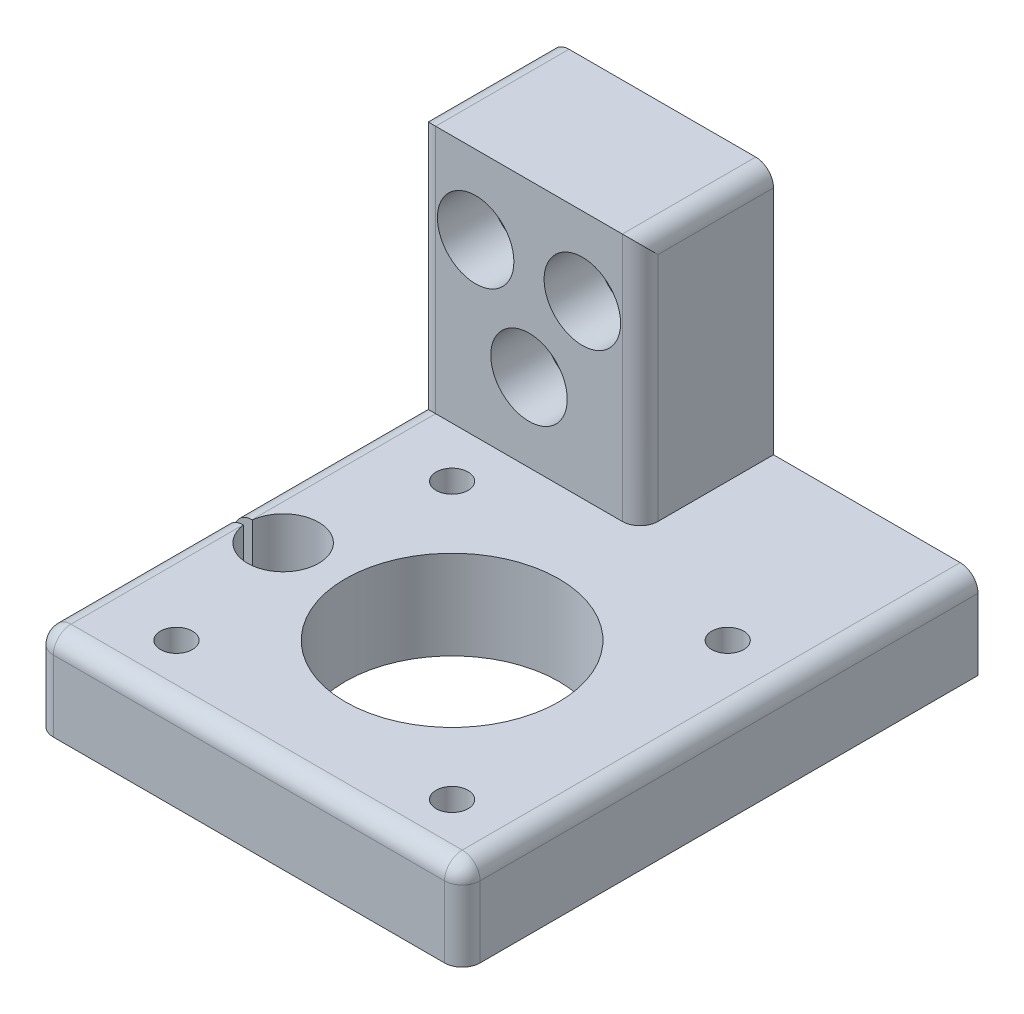
ISO-10303-21;
HEADER;
FILE_DESCRIPTION(('STEP AP214'),'2;1');
FILE_NAME('part.step','',(''),(''),'','','');
FILE_SCHEMA(('AUTOMOTIVE_DESIGN { 1 0 10303 214 1 1 1 1 }'));
ENDSEC;
DATA;
#1=APPLICATION_CONTEXT('core data for automotive mechanical design processes');
#2=APPLICATION_PROTOCOL_DEFINITION('international standard','automotive_design',2000,#1);
#3=PRODUCT_CONTEXT('',#1,'mechanical');
#4=PRODUCT('Part','Part','',(#3));
#5=PRODUCT_RELATED_PRODUCT_CATEGORY('part','',(#4));
#6=PRODUCT_DEFINITION_FORMATION('','',#4);
#7=PRODUCT_DEFINITION_CONTEXT('part definition',#1,'design');
#8=PRODUCT_DEFINITION('design','',#6,#7);
#9=PRODUCT_DEFINITION_SHAPE('','',#8);
#10=(LENGTH_UNIT() NAMED_UNIT(*) SI_UNIT(.MILLI.,.METRE.));
#11=(NAMED_UNIT(*) PLANE_ANGLE_UNIT() SI_UNIT($,.RADIAN.));
#12=(NAMED_UNIT(*) SI_UNIT($,.STERADIAN.) SOLID_ANGLE_UNIT());
#13=UNCERTAINTY_MEASURE_WITH_UNIT(LENGTH_MEASURE(1.E-05),#10,'distance_accuracy_value','');
#14=(GEOMETRIC_REPRESENTATION_CONTEXT(3) GLOBAL_UNCERTAINTY_ASSIGNED_CONTEXT((#13)) GLOBAL_UNIT_ASSIGNED_CONTEXT((#10,
#11,#12)) REPRESENTATION_CONTEXT('',''));
#15=CARTESIAN_POINT('',(0.,0.,0.));
#16=DIRECTION('',(0.,0.,1.));
#17=DIRECTION('',(1.,0.,0.));
#18=AXIS2_PLACEMENT_3D('',#15,#16,#17);
#19=CARTESIAN_POINT('',(12.5,18.8038475772934,0.));
#20=DIRECTION('',(0.,0.,1.));
#21=DIRECTION('',(1.,0.,0.));
#22=AXIS2_PLACEMENT_3D('',#19,#20,#21);
#23=CYLINDRICAL_SURFACE('',#22,2.8);
#24=CARTESIAN_POINT('',(12.5,18.8038475772934,0.));
#25=DIRECTION('',(0.,0.,1.));
#26=DIRECTION('',(1.,0.,0.));
#27=AXIS2_PLACEMENT_3D('',#24,#25,#26);
#28=CIRCLE('',#27,2.8);
#29=CARTESIAN_POINT('',(15.3,18.8038475772934,0.));
#30=VERTEX_POINT('',#29);
#31=EDGE_CURVE('E268',#30,#30,#28,.T.);
#32=ORIENTED_EDGE('',*,*,#31,.F.);
#33=EDGE_LOOP('',(#32));
#34=FACE_BOUND('',#33,.T.);
#35=CARTESIAN_POINT('',(12.5,18.8038475772934,9.));
#36=DIRECTION('',(0.,0.,1.));
#37=DIRECTION('',(1.,0.,0.));
#38=AXIS2_PLACEMENT_3D('',#35,#36,#37);
#39=CIRCLE('',#38,2.8);
#40=CARTESIAN_POINT('',(15.3,18.8038475772934,9.));
#41=VERTEX_POINT('',#40);
#42=EDGE_CURVE('E273',#41,#41,#39,.F.);
#43=ORIENTED_EDGE('',*,*,#42,.F.);
#44=EDGE_LOOP('',(#43));
#45=FACE_BOUND('',#44,.T.);
#46=ADVANCED_FACE('F37',(#34,#45),#23,.F.);
#47=CARTESIAN_POINT('',(18.5,29.1961524227066,0.));
#48=DIRECTION('',(0.,0.,1.));
#49=DIRECTION('',(1.,0.,0.));
#50=AXIS2_PLACEMENT_3D('',#47,#48,#49);
#51=CYLINDRICAL_SURFACE('',#50,2.8);
#52=CARTESIAN_POINT('',(18.5,29.1961524227066,0.));
#53=DIRECTION('',(0.,0.,1.));
#54=DIRECTION('',(1.,0.,0.));
#55=AXIS2_PLACEMENT_3D('',#52,#53,#54);
#56=CIRCLE('',#55,2.8);
#57=CARTESIAN_POINT('',(21.3,29.1961524227066,0.));
#58=VERTEX_POINT('',#57);
#59=EDGE_CURVE('E556',#58,#58,#56,.T.);
#60=ORIENTED_EDGE('',*,*,#59,.F.);
#61=EDGE_LOOP('',(#60));
#62=FACE_BOUND('',#61,.T.);
#63=CARTESIAN_POINT('',(18.5,29.1961524227066,9.));
#64=DIRECTION('',(0.,0.,1.));
#65=DIRECTION('',(1.,0.,0.));
#66=AXIS2_PLACEMENT_3D('',#63,#64,#65);
#67=CIRCLE('',#66,2.8);
#68=CARTESIAN_POINT('',(21.3,29.1961524227066,9.));
#69=VERTEX_POINT('',#68);
#70=EDGE_CURVE('E270',#69,#69,#67,.F.);
#71=ORIENTED_EDGE('',*,*,#70,.F.);
#72=EDGE_LOOP('',(#71));
#73=FACE_BOUND('',#72,.T.);
#74=ADVANCED_FACE('F446',(#62,#73),#51,.F.);
#75=CARTESIAN_POINT('',(6.50000000000001,29.1961524227066,0.));
#76=DIRECTION('',(0.,0.,1.));
#77=DIRECTION('',(1.,0.,0.));
#78=AXIS2_PLACEMENT_3D('',#75,#76,#77);
#79=CYLINDRICAL_SURFACE('',#78,2.8);
#80=CARTESIAN_POINT('',(6.50000000000001,29.1961524227066,0.));
#81=DIRECTION('',(0.,0.,1.));
#82=DIRECTION('',(1.,0.,0.));
#83=AXIS2_PLACEMENT_3D('',#80,#81,#82);
#84=CIRCLE('',#83,2.8);
#85=CARTESIAN_POINT('',(9.3,29.1961524227066,0.));
#86=VERTEX_POINT('',#85);
#87=EDGE_CURVE('E185',#86,#86,#84,.T.);
#88=ORIENTED_EDGE('',*,*,#87,.F.);
#89=EDGE_LOOP('',(#88));
#90=FACE_BOUND('',#89,.T.);
#91=CARTESIAN_POINT('',(6.50000000000001,29.1961524227066,9.));
#92=DIRECTION('',(0.,0.,1.));
#93=DIRECTION('',(1.,0.,0.));
#94=AXIS2_PLACEMENT_3D('',#91,#92,#93);
#95=CIRCLE('',#94,2.8);
#96=CARTESIAN_POINT('',(9.3,29.1961524227066,9.));
#97=VERTEX_POINT('',#96);
#98=EDGE_CURVE('E265',#97,#97,#95,.F.);
#99=ORIENTED_EDGE('',*,*,#98,.F.);
#100=EDGE_LOOP('',(#99));
#101=FACE_BOUND('',#100,.T.);
#102=ADVANCED_FACE('F452',(#90,#101),#79,.F.);
#103=CARTESIAN_POINT('',(6.00000000000001,10.,36.15));
#104=DIRECTION('',(0.,-1.,0.));
#105=DIRECTION('',(0.,0.,-1.));
#106=AXIS2_PLACEMENT_3D('',#103,#104,#105);
#107=CYLINDRICAL_SURFACE('',#106,4.00000000000001);
#108=CARTESIAN_POINT('',(6.00000000000001,0.,36.15));
#109=DIRECTION('',(0.,1.,0.));
#110=DIRECTION('',(0.,0.,1.));
#111=AXIS2_PLACEMENT_3D('',#108,#109,#110);
#112=CIRCLE('',#111,4.00000000000001);
#113=CARTESIAN_POINT('',(2.03137303340312,0.,36.65));
#114=VERTEX_POINT('',#113);
#115=CARTESIAN_POINT('',(2.03137303340312,0.,35.65));
#116=VERTEX_POINT('',#115);
#117=EDGE_CURVE('E216',#114,#116,#112,.T.);
#118=ORIENTED_EDGE('',*,*,#117,.F.);
#119=DIRECTION('',(0.,-1.,0.));
#120=VECTOR('',#119,1.);
#121=CARTESIAN_POINT('',(2.03137303340312,10.,36.65));
#122=LINE('',#121,#120);
#123=CARTESIAN_POINT('',(2.03137303340312,10.,36.65));
#124=VERTEX_POINT('',#123);
#125=EDGE_CURVE('E263',#124,#114,#122,.T.);
#126=ORIENTED_EDGE('',*,*,#125,.F.);
#127=CARTESIAN_POINT('',(6.00000000000001,10.,36.15));
#128=DIRECTION('',(0.,1.,0.));
#129=DIRECTION('',(0.,0.,1.));
#130=AXIS2_PLACEMENT_3D('',#127,#128,#129);
#131=CIRCLE('',#130,4.00000000000001);
#132=CARTESIAN_POINT('',(2.03137303340312,10.,35.65));
#133=VERTEX_POINT('',#132);
#134=EDGE_CURVE('E197',#124,#133,#131,.T.);
#135=ORIENTED_EDGE('',*,*,#134,.T.);
#136=DIRECTION('',(0.,-1.,0.));
#137=VECTOR('',#136,1.);
#138=CARTESIAN_POINT('',(2.03137303340312,10.,35.65));
#139=LINE('',#138,#137);
#140=EDGE_CURVE('E215',#133,#116,#139,.T.);
#141=ORIENTED_EDGE('',*,*,#140,.T.);
#142=EDGE_LOOP('',(#118,#126,#135,#141));
#143=FACE_BOUND('',#142,.T.);
#144=ADVANCED_FACE('F411',(#143),#107,.F.);
#145=CARTESIAN_POINT('',(-1.25191413588945E-13,10.,36.65));
#146=DIRECTION('',(0.,0.,-1.));
#147=DIRECTION('',(-1.,0.,0.));
#148=AXIS2_PLACEMENT_3D('',#145,#146,#147);
#149=PLANE('',#148);
#150=DIRECTION('',(0.,-1.,0.));
#151=VECTOR('',#150,1.);
#152=CARTESIAN_POINT('',(0.,10.,36.65));
#153=LINE('',#152,#151);
#154=CARTESIAN_POINT('',(0.,8.,36.65));
#155=VERTEX_POINT('',#154);
#156=CARTESIAN_POINT('',(0.,0.,36.65));
#157=VERTEX_POINT('',#156);
#158=EDGE_CURVE('E261',#155,#157,#153,.T.);
#159=ORIENTED_EDGE('',*,*,#158,.F.);
#160=CARTESIAN_POINT('',(2.,8.,36.65));
#161=DIRECTION('',(0.,0.,-1.));
#162=DIRECTION('',(-1.,0.,0.));
#163=AXIS2_PLACEMENT_3D('',#160,#161,#162);
#164=CIRCLE('',#163,2.);
#165=CARTESIAN_POINT('',(2.,10.,36.65));
#166=VERTEX_POINT('',#165);
#167=EDGE_CURVE('E313',#155,#166,#164,.T.);
#168=ORIENTED_EDGE('',*,*,#167,.T.);
#169=DIRECTION('',(1.,0.,0.));
#170=VECTOR('',#169,1.);
#171=CARTESIAN_POINT('',(-1.25191413588945E-13,10.,36.65));
#172=LINE('',#171,#170);
#173=EDGE_CURVE('E193',#166,#124,#172,.T.);
#174=ORIENTED_EDGE('',*,*,#173,.T.);
#175=ORIENTED_EDGE('',*,*,#125,.T.);
#176=DIRECTION('',(1.,0.,0.));
#177=VECTOR('',#176,1.);
#178=CARTESIAN_POINT('',(-1.25191413588945E-13,0.,36.65));
#179=LINE('',#178,#177);
#180=EDGE_CURVE('E219',#157,#114,#179,.T.);
#181=ORIENTED_EDGE('',*,*,#180,.F.);
#182=EDGE_LOOP('',(#159,#168,#174,#175,#181));
#183=FACE_BOUND('',#182,.T.);
#184=ADVANCED_FACE('F420',(#183),#149,.T.);
#185=CARTESIAN_POINT('',(0.,10.,0.));
#186=DIRECTION('',(1.,0.,0.));
#187=DIRECTION('',(0.,0.,-1.));
#188=AXIS2_PLACEMENT_3D('',#185,#186,#187);
#189=PLANE('',#188);
#190=DIRECTION('',(0.,0.,1.));
#191=VECTOR('',#190,1.);
#192=CARTESIAN_POINT('',(0.,0.,0.));
#193=LINE('',#192,#191);
#194=CARTESIAN_POINT('',(0.,0.,56.));
#195=VERTEX_POINT('',#194);
#196=EDGE_CURVE('E223',#157,#195,#193,.T.);
#197=ORIENTED_EDGE('',*,*,#196,.T.);
#198=DIRECTION('',(0.,-1.,0.));
#199=VECTOR('',#198,1.);
#200=CARTESIAN_POINT('',(0.,10.,56.));
#201=LINE('',#200,#199);
#202=CARTESIAN_POINT('',(0.,8.,56.));
#203=VERTEX_POINT('',#202);
#204=EDGE_CURVE('E311',#195,#203,#201,.F.);
#205=ORIENTED_EDGE('',*,*,#204,.T.);
#206=DIRECTION('',(0.,0.,1.));
#207=VECTOR('',#206,1.);
#208=CARTESIAN_POINT('',(0.,8.,36.65));
#209=LINE('',#208,#207);
#210=EDGE_CURVE('E309',#203,#155,#209,.F.);
#211=ORIENTED_EDGE('',*,*,#210,.T.);
#212=ORIENTED_EDGE('',*,*,#158,.T.);
#213=EDGE_LOOP('',(#197,#205,#211,#212));
#214=FACE_BOUND('',#213,.T.);
#215=ADVANCED_FACE('F426',(#214),#189,.F.);
#216=CARTESIAN_POINT('',(0.,10.,58.));
#217=DIRECTION('',(0.,0.,-1.));
#218=DIRECTION('',(-1.,0.,0.));
#219=AXIS2_PLACEMENT_3D('',#216,#217,#218);
#220=PLANE('',#219);
#221=DIRECTION('',(1.,0.,0.));
#222=VECTOR('',#221,1.);
#223=CARTESIAN_POINT('',(0.,0.,58.));
#224=LINE('',#223,#222);
#225=CARTESIAN_POINT('',(2.,0.,58.));
#226=VERTEX_POINT('',#225);
#227=CARTESIAN_POINT('',(46.,0.,58.));
#228=VERTEX_POINT('',#227);
#229=EDGE_CURVE('E226',#226,#228,#224,.T.);
#230=ORIENTED_EDGE('',*,*,#229,.T.);
#231=DIRECTION('',(0.,-1.,0.));
#232=VECTOR('',#231,1.);
#233=CARTESIAN_POINT('',(46.,10.,58.));
#234=LINE('',#233,#232);
#235=CARTESIAN_POINT('',(46.,8.,58.));
#236=VERTEX_POINT('',#235);
#237=EDGE_CURVE('E307',#228,#236,#234,.F.);
#238=ORIENTED_EDGE('',*,*,#237,.T.);
#239=DIRECTION('',(1.,0.,0.));
#240=VECTOR('',#239,1.);
#241=CARTESIAN_POINT('',(0.,8.,58.));
#242=LINE('',#241,#240);
#243=CARTESIAN_POINT('',(2.,8.,58.));
#244=VERTEX_POINT('',#243);
#245=EDGE_CURVE('E303',#236,#244,#242,.F.);
#246=ORIENTED_EDGE('',*,*,#245,.T.);
#247=DIRECTION('',(0.,-1.,0.));
#248=VECTOR('',#247,1.);
#249=CARTESIAN_POINT('',(2.,10.,58.));
#250=LINE('',#249,#248);
#251=EDGE_CURVE('E305',#244,#226,#250,.T.);
#252=ORIENTED_EDGE('',*,*,#251,.T.);
#253=EDGE_LOOP('',(#230,#238,#246,#252));
#254=FACE_BOUND('',#253,.T.);
#255=ADVANCED_FACE('F432',(#254),#220,.F.);
#256=CARTESIAN_POINT('',(48.,10.,0.));
#257=DIRECTION('',(1.,0.,0.));
#258=DIRECTION('',(0.,0.,-1.));
#259=AXIS2_PLACEMENT_3D('',#256,#257,#258);
#260=PLANE('',#259);
#261=DIRECTION('',(0.,0.,1.));
#262=VECTOR('',#261,1.);
#263=CARTESIAN_POINT('',(48.,8.,0.));
#264=LINE('',#263,#262);
#265=CARTESIAN_POINT('',(48.,8.,0.));
#266=VERTEX_POINT('',#265);
#267=CARTESIAN_POINT('',(48.,8.,56.));
#268=VERTEX_POINT('',#267);
#269=EDGE_CURVE('E294',#266,#268,#264,.T.);
#270=ORIENTED_EDGE('',*,*,#269,.T.);
#271=DIRECTION('',(0.,-1.,0.));
#272=VECTOR('',#271,1.);
#273=CARTESIAN_POINT('',(48.,0.,56.));
#274=LINE('',#273,#272);
#275=CARTESIAN_POINT('',(48.,0.,56.));
#276=VERTEX_POINT('',#275);
#277=EDGE_CURVE('E296',#268,#276,#274,.T.);
#278=ORIENTED_EDGE('',*,*,#277,.T.);
#279=DIRECTION('',(0.,0.,1.));
#280=VECTOR('',#279,1.);
#281=CARTESIAN_POINT('',(48.,0.,0.));
#282=LINE('',#281,#280);
#283=CARTESIAN_POINT('',(48.,0.,0.));
#284=VERTEX_POINT('',#283);
#285=EDGE_CURVE('E230',#284,#276,#282,.T.);
#286=ORIENTED_EDGE('',*,*,#285,.F.);
#287=DIRECTION('',(0.,-1.,0.));
#288=VECTOR('',#287,1.);
#289=CARTESIAN_POINT('',(48.,10.,0.));
#290=LINE('',#289,#288);
#291=EDGE_CURVE('E259',#266,#284,#290,.T.);
#292=ORIENTED_EDGE('',*,*,#291,.F.);
#293=EDGE_LOOP('',(#270,#278,#286,#292));
#294=FACE_BOUND('',#293,.T.);
#295=ADVANCED_FACE('F376',(#294),#260,.T.);
#296=CARTESIAN_POINT('',(0.,10.,0.));
#297=DIRECTION('',(0.,0.,-1.));
#298=DIRECTION('',(-1.,0.,0.));
#299=AXIS2_PLACEMENT_3D('',#296,#297,#298);
#300=PLANE('',#299);
#301=ORIENTED_EDGE('',*,*,#59,.T.);
#302=EDGE_LOOP('',(#301));
#303=FACE_BOUND('',#302,.T.);
#304=ORIENTED_EDGE('',*,*,#31,.T.);
#305=EDGE_LOOP('',(#304));
#306=FACE_BOUND('',#305,.T.);
#307=ORIENTED_EDGE('',*,*,#87,.T.);
#308=EDGE_LOOP('',(#307));
#309=FACE_BOUND('',#308,.T.);
#310=DIRECTION('',(1.,0.,0.));
#311=VECTOR('',#310,1.);
#312=CARTESIAN_POINT('',(0.,10.,0.));
#313=LINE('',#312,#311);
#314=CARTESIAN_POINT('',(25.,10.,0.));
#315=VERTEX_POINT('',#314);
#316=CARTESIAN_POINT('',(46.,10.,0.));
#317=VERTEX_POINT('',#316);
#318=EDGE_CURVE('E180',#315,#317,#313,.T.);
#319=ORIENTED_EDGE('',*,*,#318,.T.);
#320=CARTESIAN_POINT('',(46.,8.,0.));
#321=DIRECTION('',(0.,0.,-1.));
#322=DIRECTION('',(-1.,0.,0.));
#323=AXIS2_PLACEMENT_3D('',#320,#321,#322);
#324=CIRCLE('',#323,2.);
#325=EDGE_CURVE('E318',#317,#266,#324,.T.);
#326=ORIENTED_EDGE('',*,*,#325,.T.);
#327=ORIENTED_EDGE('',*,*,#291,.T.);
#328=DIRECTION('',(1.,0.,0.));
#329=VECTOR('',#328,1.);
#330=CARTESIAN_POINT('',(0.,0.,0.));
#331=LINE('',#330,#329);
#332=CARTESIAN_POINT('',(0.,0.,0.));
#333=VERTEX_POINT('',#332);
#334=EDGE_CURVE('E233',#333,#284,#331,.T.);
#335=ORIENTED_EDGE('',*,*,#334,.F.);
#336=DIRECTION('',(0.,-1.,0.));
#337=VECTOR('',#336,1.);
#338=CARTESIAN_POINT('',(0.,10.,0.));
#339=LINE('',#338,#337);
#340=CARTESIAN_POINT('',(0.,36.,0.));
#341=VERTEX_POINT('',#340);
#342=EDGE_CURVE('E257',#341,#333,#339,.T.);
#343=ORIENTED_EDGE('',*,*,#342,.F.);
#344=CARTESIAN_POINT('',(2.,36.,0.));
#345=DIRECTION('',(0.,0.,-1.));
#346=DIRECTION('',(-1.,0.,0.));
#347=AXIS2_PLACEMENT_3D('',#344,#345,#346);
#348=CIRCLE('',#347,2.);
#349=CARTESIAN_POINT('',(2.,38.,0.));
#350=VERTEX_POINT('',#349);
#351=EDGE_CURVE('E316',#341,#350,#348,.T.);
#352=ORIENTED_EDGE('',*,*,#351,.T.);
#353=DIRECTION('',(-1.,0.,0.));
#354=VECTOR('',#353,1.);
#355=CARTESIAN_POINT('',(25.,38.,0.));
#356=LINE('',#355,#354);
#357=CARTESIAN_POINT('',(23.,38.,0.));
#358=VERTEX_POINT('',#357);
#359=EDGE_CURVE('E220',#358,#350,#356,.T.);
#360=ORIENTED_EDGE('',*,*,#359,.F.);
#361=CARTESIAN_POINT('',(23.,36.,0.));
#362=DIRECTION('',(0.,0.,-1.));
#363=DIRECTION('',(-1.,0.,0.));
#364=AXIS2_PLACEMENT_3D('',#361,#362,#363);
#365=CIRCLE('',#364,2.);
#366=CARTESIAN_POINT('',(25.,36.,0.));
#367=VERTEX_POINT('',#366);
#368=EDGE_CURVE('E184',#358,#367,#365,.T.);
#369=ORIENTED_EDGE('',*,*,#368,.T.);
#370=DIRECTION('',(0.,1.,0.));
#371=VECTOR('',#370,1.);
#372=CARTESIAN_POINT('',(25.,10.,0.));
#373=LINE('',#372,#371);
#374=EDGE_CURVE('E171',#315,#367,#373,.T.);
#375=ORIENTED_EDGE('',*,*,#374,.F.);
#376=EDGE_LOOP('',(#319,#326,#327,#335,#343,#352,#360,#369,#375));
#377=FACE_BOUND('',#376,.T.);
#378=ADVANCED_FACE('F179',(#303,#306,#309,#377),#300,.T.);
#379=DIRECTION('',(0.,-1.,0.));
#380=VECTOR('',#379,1.);
#381=CARTESIAN_POINT('',(0.,10.,35.65));
#382=LINE('',#381,#380);
#383=CARTESIAN_POINT('',(0.,8.,35.65));
#384=VERTEX_POINT('',#383);
#385=CARTESIAN_POINT('',(0.,0.,35.65));
#386=VERTEX_POINT('',#385);
#387=EDGE_CURVE('E255',#384,#386,#382,.T.);
#388=ORIENTED_EDGE('',*,*,#387,.F.);
#389=DIRECTION('',(0.,0.,1.));
#390=VECTOR('',#389,1.);
#391=CARTESIAN_POINT('',(0.,8.,15.));
#392=LINE('',#391,#390);
#393=CARTESIAN_POINT('',(0.,8.,13.));
#394=VERTEX_POINT('',#393);
#395=EDGE_CURVE('E292',#384,#394,#392,.F.);
#396=ORIENTED_EDGE('',*,*,#395,.T.);
#397=DIRECTION('',(0.,-1.,0.));
#398=VECTOR('',#397,1.);
#399=CARTESIAN_POINT('',(0.,10.,13.));
#400=LINE('',#399,#398);
#401=CARTESIAN_POINT('',(0.,36.,13.));
#402=VERTEX_POINT('',#401);
#403=EDGE_CURVE('E290',#394,#402,#400,.F.);
#404=ORIENTED_EDGE('',*,*,#403,.T.);
#405=DIRECTION('',(0.,0.,1.));
#406=VECTOR('',#405,1.);
#407=CARTESIAN_POINT('',(0.,36.,0.));
#408=LINE('',#407,#406);
#409=EDGE_CURVE('E288',#402,#341,#408,.F.);
#410=ORIENTED_EDGE('',*,*,#409,.T.);
#411=ORIENTED_EDGE('',*,*,#342,.T.);
#412=EDGE_CURVE('E227',#333,#386,#193,.T.);
#413=ORIENTED_EDGE('',*,*,#412,.T.);
#414=EDGE_LOOP('',(#388,#396,#404,#410,#411,#413));
#415=FACE_BOUND('',#414,.T.);
#416=ADVANCED_FACE('F483',(#415),#189,.F.);
#417=CARTESIAN_POINT('',(40.5,10.,20.65));
#418=DIRECTION('',(0.,-1.,0.));
#419=DIRECTION('',(0.,0.,-1.));
#420=AXIS2_PLACEMENT_3D('',#417,#418,#419);
#421=CYLINDRICAL_SURFACE('',#420,1.8);
#422=CARTESIAN_POINT('',(40.5,10.,20.65));
#423=DIRECTION('',(0.,1.,0.));
#424=DIRECTION('',(0.,0.,1.));
#425=AXIS2_PLACEMENT_3D('',#422,#423,#424);
#426=CIRCLE('',#425,1.8);
#427=CARTESIAN_POINT('',(40.5,10.,22.45));
#428=VERTEX_POINT('',#427);
#429=EDGE_CURVE('E209',#428,#428,#426,.T.);
#430=ORIENTED_EDGE('',*,*,#429,.T.);
#431=EDGE_LOOP('',(#430));
#432=FACE_BOUND('',#431,.T.);
#433=CARTESIAN_POINT('',(40.5,0.,20.65));
#434=DIRECTION('',(0.,1.,0.));
#435=DIRECTION('',(0.,0.,1.));
#436=AXIS2_PLACEMENT_3D('',#433,#434,#435);
#437=CIRCLE('',#436,1.8);
#438=CARTESIAN_POINT('',(40.5,0.,22.45));
#439=VERTEX_POINT('',#438);
#440=EDGE_CURVE('E248',#439,#439,#437,.T.);
#441=ORIENTED_EDGE('',*,*,#440,.F.);
#442=EDGE_LOOP('',(#441));
#443=FACE_BOUND('',#442,.T.);
#444=ADVANCED_FACE('F479',(#432,#443),#421,.F.);
#445=CARTESIAN_POINT('',(40.5,10.,51.65));
#446=DIRECTION('',(0.,-1.,0.));
#447=DIRECTION('',(0.,0.,-1.));
#448=AXIS2_PLACEMENT_3D('',#445,#446,#447);
#449=CYLINDRICAL_SURFACE('',#448,1.8);
#450=CARTESIAN_POINT('',(40.5,10.,51.65));
#451=DIRECTION('',(0.,1.,0.));
#452=DIRECTION('',(0.,0.,1.));
#453=AXIS2_PLACEMENT_3D('',#450,#451,#452);
#454=CIRCLE('',#453,1.8);
#455=CARTESIAN_POINT('',(40.5,10.,53.45));
#456=VERTEX_POINT('',#455);
#457=EDGE_CURVE('E206',#456,#456,#454,.T.);
#458=ORIENTED_EDGE('',*,*,#457,.T.);
#459=EDGE_LOOP('',(#458));
#460=FACE_BOUND('',#459,.T.);
#461=CARTESIAN_POINT('',(40.5,0.,51.65));
#462=DIRECTION('',(0.,1.,0.));
#463=DIRECTION('',(0.,0.,1.));
#464=AXIS2_PLACEMENT_3D('',#461,#462,#463);
#465=CIRCLE('',#464,1.8);
#466=CARTESIAN_POINT('',(40.5,0.,53.45));
#467=VERTEX_POINT('',#466);
#468=EDGE_CURVE('E245',#467,#467,#465,.T.);
#469=ORIENTED_EDGE('',*,*,#468,.F.);
#470=EDGE_LOOP('',(#469));
#471=FACE_BOUND('',#470,.T.);
#472=ADVANCED_FACE('F482',(#460,#471),#449,.F.);
#473=CARTESIAN_POINT('',(9.5,10.,51.65));
#474=DIRECTION('',(0.,-1.,0.));
#475=DIRECTION('',(0.,0.,-1.));
#476=AXIS2_PLACEMENT_3D('',#473,#474,#475);
#477=CYLINDRICAL_SURFACE('',#476,1.8);
#478=CARTESIAN_POINT('',(9.5,10.,51.65));
#479=DIRECTION('',(0.,1.,0.));
#480=DIRECTION('',(0.,0.,1.));
#481=AXIS2_PLACEMENT_3D('',#478,#479,#480);
#482=CIRCLE('',#481,1.8);
#483=CARTESIAN_POINT('',(9.5,10.,53.45));
#484=VERTEX_POINT('',#483);
#485=EDGE_CURVE('E203',#484,#484,#482,.T.);
#486=ORIENTED_EDGE('',*,*,#485,.T.);
#487=EDGE_LOOP('',(#486));
#488=FACE_BOUND('',#487,.T.);
#489=CARTESIAN_POINT('',(9.5,0.,51.65));
#490=DIRECTION('',(0.,1.,0.));
#491=DIRECTION('',(0.,0.,1.));
#492=AXIS2_PLACEMENT_3D('',#489,#490,#491);
#493=CIRCLE('',#492,1.8);
#494=CARTESIAN_POINT('',(9.5,0.,53.45));
#495=VERTEX_POINT('',#494);
#496=EDGE_CURVE('E242',#495,#495,#493,.T.);
#497=ORIENTED_EDGE('',*,*,#496,.F.);
#498=EDGE_LOOP('',(#497));
#499=FACE_BOUND('',#498,.T.);
#500=ADVANCED_FACE('F487',(#488,#499),#477,.F.);
#501=CARTESIAN_POINT('',(25.,10.,36.15));
#502=DIRECTION('',(0.,-1.,0.));
#503=DIRECTION('',(0.,0.,-1.));
#504=AXIS2_PLACEMENT_3D('',#501,#502,#503);
#505=CYLINDRICAL_SURFACE('',#504,12.);
#506=CARTESIAN_POINT('',(25.,10.,36.15));
#507=DIRECTION('',(0.,1.,0.));
#508=DIRECTION('',(0.,0.,1.));
#509=AXIS2_PLACEMENT_3D('',#506,#507,#508);
#510=CIRCLE('',#509,12.);
#511=CARTESIAN_POINT('',(25.,10.,48.15));
#512=VERTEX_POINT('',#511);
#513=EDGE_CURVE('E195',#512,#512,#510,.T.);
#514=ORIENTED_EDGE('',*,*,#513,.T.);
#515=EDGE_LOOP('',(#514));
#516=FACE_BOUND('',#515,.T.);
#517=CARTESIAN_POINT('',(25.,0.,36.15));
#518=DIRECTION('',(0.,1.,0.));
#519=DIRECTION('',(0.,0.,1.));
#520=AXIS2_PLACEMENT_3D('',#517,#518,#519);
#521=CIRCLE('',#520,12.);
#522=CARTESIAN_POINT('',(25.,0.,48.15));
#523=VERTEX_POINT('',#522);
#524=EDGE_CURVE('E239',#523,#523,#521,.T.);
#525=ORIENTED_EDGE('',*,*,#524,.F.);
#526=EDGE_LOOP('',(#525));
#527=FACE_BOUND('',#526,.T.);
#528=ADVANCED_FACE('F491',(#516,#527),#505,.F.);
#529=CARTESIAN_POINT('',(-1.21775549643817E-13,10.,35.65));
#530=DIRECTION('',(0.,0.,-1.));
#531=DIRECTION('',(-1.,0.,0.));
#532=AXIS2_PLACEMENT_3D('',#529,#530,#531);
#533=PLANE('',#532);
#534=DIRECTION('',(1.,0.,0.));
#535=VECTOR('',#534,1.);
#536=CARTESIAN_POINT('',(-1.21775549643817E-13,10.,35.65));
#537=LINE('',#536,#535);
#538=CARTESIAN_POINT('',(2.,10.,35.65));
#539=VERTEX_POINT('',#538);
#540=EDGE_CURVE('E192',#539,#133,#537,.T.);
#541=ORIENTED_EDGE('',*,*,#540,.F.);
#542=CARTESIAN_POINT('',(2.,8.,35.65));
#543=DIRECTION('',(0.,0.,-1.));
#544=DIRECTION('',(-1.,0.,0.));
#545=AXIS2_PLACEMENT_3D('',#542,#543,#544);
#546=CIRCLE('',#545,2.);
#547=EDGE_CURVE('E286',#539,#384,#546,.F.);
#548=ORIENTED_EDGE('',*,*,#547,.T.);
#549=ORIENTED_EDGE('',*,*,#387,.T.);
#550=DIRECTION('',(1.,0.,0.));
#551=VECTOR('',#550,1.);
#552=CARTESIAN_POINT('',(-1.21775549643817E-13,0.,35.65));
#553=LINE('',#552,#551);
#554=EDGE_CURVE('E236',#386,#116,#553,.T.);
#555=ORIENTED_EDGE('',*,*,#554,.T.);
#556=ORIENTED_EDGE('',*,*,#140,.F.);
#557=EDGE_LOOP('',(#541,#548,#549,#555,#556));
#558=FACE_BOUND('',#557,.T.);
#559=ADVANCED_FACE('F414',(#558),#533,.F.);
#560=CARTESIAN_POINT('',(9.5,10.,20.65));
#561=DIRECTION('',(0.,-1.,0.));
#562=DIRECTION('',(0.,0.,-1.));
#563=AXIS2_PLACEMENT_3D('',#560,#561,#562);
#564=CYLINDRICAL_SURFACE('',#563,1.8);
#565=CARTESIAN_POINT('',(9.5,10.,20.65));
#566=DIRECTION('',(0.,1.,0.));
#567=DIRECTION('',(0.,0.,1.));
#568=AXIS2_PLACEMENT_3D('',#565,#566,#567);
#569=CIRCLE('',#568,1.8);
#570=CARTESIAN_POINT('',(9.5,10.,22.45));
#571=VERTEX_POINT('',#570);
#572=EDGE_CURVE('E212',#571,#571,#569,.T.);
#573=ORIENTED_EDGE('',*,*,#572,.T.);
#574=EDGE_LOOP('',(#573));
#575=FACE_BOUND('',#574,.T.);
#576=CARTESIAN_POINT('',(9.5,0.,20.65));
#577=DIRECTION('',(0.,1.,0.));
#578=DIRECTION('',(0.,0.,1.));
#579=AXIS2_PLACEMENT_3D('',#576,#577,#578);
#580=CIRCLE('',#579,1.8);
#581=CARTESIAN_POINT('',(9.5,0.,22.45));
#582=VERTEX_POINT('',#581);
#583=EDGE_CURVE('E251',#582,#582,#580,.T.);
#584=ORIENTED_EDGE('',*,*,#583,.F.);
#585=EDGE_LOOP('',(#584));
#586=FACE_BOUND('',#585,.T.);
#587=ADVANCED_FACE('F473',(#575,#586),#564,.F.);
#588=CARTESIAN_POINT('',(0.,10.,0.));
#589=DIRECTION('',(0.,1.,0.));
#590=DIRECTION('',(0.,0.,1.));
#591=AXIS2_PLACEMENT_3D('',#588,#589,#590);
#592=PLANE('',#591);
#593=DIRECTION('',(-1.,0.,0.));
#594=VECTOR('',#593,1.);
#595=CARTESIAN_POINT('',(25.,10.,15.));
#596=LINE('',#595,#594);
#597=CARTESIAN_POINT('',(23.,10.,15.));
#598=VERTEX_POINT('',#597);
#599=CARTESIAN_POINT('',(2.,10.,15.));
#600=VERTEX_POINT('',#599);
#601=EDGE_CURVE('E175',#598,#600,#596,.T.);
#602=ORIENTED_EDGE('',*,*,#601,.T.);
#603=DIRECTION('',(0.,0.,1.));
#604=VECTOR('',#603,1.);
#605=CARTESIAN_POINT('',(2.,10.,35.65));
#606=LINE('',#605,#604);
#607=EDGE_CURVE('E283',#600,#539,#606,.T.);
#608=ORIENTED_EDGE('',*,*,#607,.T.);
#609=ORIENTED_EDGE('',*,*,#540,.T.);
#610=ORIENTED_EDGE('',*,*,#134,.F.);
#611=ORIENTED_EDGE('',*,*,#173,.F.);
#612=DIRECTION('',(0.,0.,1.));
#613=VECTOR('',#612,1.);
#614=CARTESIAN_POINT('',(2.,10.,58.));
#615=LINE('',#614,#613);
#616=CARTESIAN_POINT('',(2.,10.,56.));
#617=VERTEX_POINT('',#616);
#618=EDGE_CURVE('E281',#166,#617,#615,.T.);
#619=ORIENTED_EDGE('',*,*,#618,.T.);
#620=DIRECTION('',(1.,0.,0.));
#621=VECTOR('',#620,1.);
#622=CARTESIAN_POINT('',(48.,10.,56.));
#623=LINE('',#622,#621);
#624=CARTESIAN_POINT('',(46.,10.,56.));
#625=VERTEX_POINT('',#624);
#626=EDGE_CURVE('E279',#617,#625,#623,.T.);
#627=ORIENTED_EDGE('',*,*,#626,.T.);
#628=DIRECTION('',(0.,0.,1.));
#629=VECTOR('',#628,1.);
#630=CARTESIAN_POINT('',(46.,10.,0.));
#631=LINE('',#630,#629);
#632=EDGE_CURVE('E191',#625,#317,#631,.F.);
#633=ORIENTED_EDGE('',*,*,#632,.T.);
#634=ORIENTED_EDGE('',*,*,#318,.F.);
#635=DIRECTION('',(0.,0.,-1.));
#636=VECTOR('',#635,1.);
#637=CARTESIAN_POINT('',(25.,10.,0.));
#638=LINE('',#637,#636);
#639=CARTESIAN_POINT('',(25.,10.,13.));
#640=VERTEX_POINT('',#639);
#641=EDGE_CURVE('E168',#640,#315,#638,.T.);
#642=ORIENTED_EDGE('',*,*,#641,.F.);
#643=CARTESIAN_POINT('',(23.,10.,13.));
#644=DIRECTION('',(0.,1.,0.));
#645=DIRECTION('',(0.,0.,1.));
#646=AXIS2_PLACEMENT_3D('',#643,#644,#645);
#647=CIRCLE('',#646,2.);
#648=EDGE_CURVE('E11',#640,#598,#647,.F.);
#649=ORIENTED_EDGE('',*,*,#648,.T.);
#650=EDGE_LOOP('',(#602,#608,#609,#610,#611,#619,#627,#633,#634,#642,#649));
#651=FACE_BOUND('',#650,.T.);
#652=ORIENTED_EDGE('',*,*,#513,.F.);
#653=EDGE_LOOP('',(#652));
#654=FACE_BOUND('',#653,.T.);
#655=ORIENTED_EDGE('',*,*,#485,.F.);
#656=EDGE_LOOP('',(#655));
#657=FACE_BOUND('',#656,.T.);
#658=ORIENTED_EDGE('',*,*,#457,.F.);
#659=EDGE_LOOP('',(#658));
#660=FACE_BOUND('',#659,.T.);
#661=ORIENTED_EDGE('',*,*,#429,.F.);
#662=EDGE_LOOP('',(#661));
#663=FACE_BOUND('',#662,.T.);
#664=ORIENTED_EDGE('',*,*,#572,.F.);
#665=EDGE_LOOP('',(#664));
#666=FACE_BOUND('',#665,.T.);
#667=ADVANCED_FACE('F188',(#651,#654,#657,#660,#663,#666),#592,.T.);
#668=CARTESIAN_POINT('',(0.,0.,0.));
#669=DIRECTION('',(0.,1.,0.));
#670=DIRECTION('',(0.,0.,1.));
#671=AXIS2_PLACEMENT_3D('',#668,#669,#670);
#672=PLANE('',#671);
#673=ORIENTED_EDGE('',*,*,#285,.T.);
#674=CARTESIAN_POINT('',(46.,0.,56.));
#675=DIRECTION('',(0.,1.,0.));
#676=DIRECTION('',(0.,0.,1.));
#677=AXIS2_PLACEMENT_3D('',#674,#675,#676);
#678=CIRCLE('',#677,2.);
#679=EDGE_CURVE('E301',#276,#228,#678,.F.);
#680=ORIENTED_EDGE('',*,*,#679,.T.);
#681=ORIENTED_EDGE('',*,*,#229,.F.);
#682=CARTESIAN_POINT('',(2.,0.,56.));
#683=DIRECTION('',(0.,1.,0.));
#684=DIRECTION('',(0.,0.,1.));
#685=AXIS2_PLACEMENT_3D('',#682,#683,#684);
#686=CIRCLE('',#685,2.);
#687=EDGE_CURVE('E299',#226,#195,#686,.F.);
#688=ORIENTED_EDGE('',*,*,#687,.T.);
#689=ORIENTED_EDGE('',*,*,#196,.F.);
#690=ORIENTED_EDGE('',*,*,#180,.T.);
#691=ORIENTED_EDGE('',*,*,#117,.T.);
#692=ORIENTED_EDGE('',*,*,#554,.F.);
#693=ORIENTED_EDGE('',*,*,#412,.F.);
#694=ORIENTED_EDGE('',*,*,#334,.T.);
#695=EDGE_LOOP('',(#673,#680,#681,#688,#689,#690,#691,#692,#693,#694));
#696=FACE_BOUND('',#695,.T.);
#697=ORIENTED_EDGE('',*,*,#524,.T.);
#698=EDGE_LOOP('',(#697));
#699=FACE_BOUND('',#698,.T.);
#700=ORIENTED_EDGE('',*,*,#496,.T.);
#701=EDGE_LOOP('',(#700));
#702=FACE_BOUND('',#701,.T.);
#703=ORIENTED_EDGE('',*,*,#468,.T.);
#704=EDGE_LOOP('',(#703));
#705=FACE_BOUND('',#704,.T.);
#706=ORIENTED_EDGE('',*,*,#440,.T.);
#707=EDGE_LOOP('',(#706));
#708=FACE_BOUND('',#707,.T.);
#709=ORIENTED_EDGE('',*,*,#583,.T.);
#710=EDGE_LOOP('',(#709));
#711=FACE_BOUND('',#710,.T.);
#712=ADVANCED_FACE('F380',(#696,#699,#702,#705,#708,#711),#672,.F.);
#713=CARTESIAN_POINT('',(25.,38.,0.));
#714=DIRECTION('',(0.,-1.,0.));
#715=DIRECTION('',(0.,0.,-1.));
#716=AXIS2_PLACEMENT_3D('',#713,#714,#715);
#717=PLANE('',#716);
#718=ORIENTED_EDGE('',*,*,#359,.T.);
#719=DIRECTION('',(0.,0.,1.));
#720=VECTOR('',#719,1.);
#721=CARTESIAN_POINT('',(2.,38.,0.));
#722=LINE('',#721,#720);
#723=CARTESIAN_POINT('',(2.,38.,15.));
#724=VERTEX_POINT('',#723);
#725=EDGE_CURVE('E62',#350,#724,#722,.T.);
#726=ORIENTED_EDGE('',*,*,#725,.T.);
#727=DIRECTION('',(-1.,0.,0.));
#728=VECTOR('',#727,1.);
#729=CARTESIAN_POINT('',(25.,38.,15.));
#730=LINE('',#729,#728);
#731=CARTESIAN_POINT('',(23.,38.,15.));
#732=VERTEX_POINT('',#731);
#733=EDGE_CURVE('E401',#732,#724,#730,.T.);
#734=ORIENTED_EDGE('',*,*,#733,.F.);
#735=DIRECTION('',(0.,0.,1.));
#736=VECTOR('',#735,1.);
#737=CARTESIAN_POINT('',(23.,38.,0.));
#738=LINE('',#737,#736);
#739=EDGE_CURVE('E324',#732,#358,#738,.F.);
#740=ORIENTED_EDGE('',*,*,#739,.T.);
#741=EDGE_LOOP('',(#718,#726,#734,#740));
#742=FACE_BOUND('',#741,.T.);
#743=ADVANCED_FACE('F467',(#742),#717,.F.);
#744=CARTESIAN_POINT('',(25.,10.,15.));
#745=DIRECTION('',(0.,0.,-1.));
#746=DIRECTION('',(-1.,0.,0.));
#747=AXIS2_PLACEMENT_3D('',#744,#745,#746);
#748=PLANE('',#747);
#749=CARTESIAN_POINT('',(18.5,29.1961524227066,15.));
#750=DIRECTION('',(0.,0.,1.));
#751=DIRECTION('',(1.,0.,0.));
#752=AXIS2_PLACEMENT_3D('',#749,#750,#751);
#753=CIRCLE('',#752,4.3);
#754=CARTESIAN_POINT('',(22.8,29.1961524227066,15.));
#755=VERTEX_POINT('',#754);
#756=EDGE_CURVE('E577',#755,#755,#753,.T.);
#757=ORIENTED_EDGE('',*,*,#756,.F.);
#758=EDGE_LOOP('',(#757));
#759=FACE_BOUND('',#758,.T.);
#760=CARTESIAN_POINT('',(12.5,18.8038475772934,15.));
#761=DIRECTION('',(0.,0.,1.));
#762=DIRECTION('',(1.,0.,0.));
#763=AXIS2_PLACEMENT_3D('',#760,#761,#762);
#764=CIRCLE('',#763,4.3);
#765=CARTESIAN_POINT('',(16.8,18.8038475772934,15.));
#766=VERTEX_POINT('',#765);
#767=EDGE_CURVE('E336',#766,#766,#764,.T.);
#768=ORIENTED_EDGE('',*,*,#767,.F.);
#769=EDGE_LOOP('',(#768));
#770=FACE_BOUND('',#769,.T.);
#771=CARTESIAN_POINT('',(6.50000000000001,29.1961524227066,15.));
#772=DIRECTION('',(0.,0.,1.));
#773=DIRECTION('',(1.,0.,0.));
#774=AXIS2_PLACEMENT_3D('',#771,#772,#773);
#775=CIRCLE('',#774,4.3);
#776=CARTESIAN_POINT('',(10.8,29.1961524227066,15.));
#777=VERTEX_POINT('',#776);
#778=EDGE_CURVE('E277',#777,#777,#775,.T.);
#779=ORIENTED_EDGE('',*,*,#778,.F.);
#780=EDGE_LOOP('',(#779));
#781=FACE_BOUND('',#780,.T.);
#782=ORIENTED_EDGE('',*,*,#733,.T.);
#783=DIRECTION('',(0.,-1.,0.));
#784=VECTOR('',#783,1.);
#785=CARTESIAN_POINT('',(2.,10.,15.));
#786=LINE('',#785,#784);
#787=EDGE_CURVE('E322',#724,#600,#786,.T.);
#788=ORIENTED_EDGE('',*,*,#787,.T.);
#789=ORIENTED_EDGE('',*,*,#601,.F.);
#790=DIRECTION('',(0.,-1.,0.));
#791=VECTOR('',#790,1.);
#792=CARTESIAN_POINT('',(23.,38.,15.));
#793=LINE('',#792,#791);
#794=EDGE_CURVE('E320',#598,#732,#793,.F.);
#795=ORIENTED_EDGE('',*,*,#794,.T.);
#796=EDGE_LOOP('',(#782,#788,#789,#795));
#797=FACE_BOUND('',#796,.T.);
#798=ADVANCED_FACE('F399',(#759,#770,#781,#797),#748,.F.);
#799=CARTESIAN_POINT('',(25.,0.,0.));
#800=DIRECTION('',(1.,0.,0.));
#801=DIRECTION('',(0.,0.,-1.));
#802=AXIS2_PLACEMENT_3D('',#799,#800,#801);
#803=PLANE('',#802);
#804=DIRECTION('',(0.,0.,1.));
#805=VECTOR('',#804,1.);
#806=CARTESIAN_POINT('',(25.,36.,15.));
#807=LINE('',#806,#805);
#808=CARTESIAN_POINT('',(25.,36.,13.));
#809=VERTEX_POINT('',#808);
#810=EDGE_CURVE('E54',#367,#809,#807,.T.);
#811=ORIENTED_EDGE('',*,*,#810,.T.);
#812=DIRECTION('',(0.,-1.,0.));
#813=VECTOR('',#812,1.);
#814=CARTESIAN_POINT('',(25.,10.,13.));
#815=LINE('',#814,#813);
#816=EDGE_CURVE('E46',#809,#640,#815,.T.);
#817=ORIENTED_EDGE('',*,*,#816,.T.);
#818=ORIENTED_EDGE('',*,*,#641,.T.);
#819=ORIENTED_EDGE('',*,*,#374,.T.);
#820=EDGE_LOOP('',(#811,#817,#818,#819));
#821=FACE_BOUND('',#820,.T.);
#822=ADVANCED_FACE('F170',(#821),#803,.T.);
#823=CARTESIAN_POINT('',(6.50000000000001,29.1961524227066,9.));
#824=DIRECTION('',(0.,0.,1.));
#825=DIRECTION('',(1.,0.,0.));
#826=AXIS2_PLACEMENT_3D('',#823,#824,#825);
#827=PLANE('',#826);
#828=CARTESIAN_POINT('',(6.50000000000001,29.1961524227066,9.));
#829=DIRECTION('',(0.,0.,1.));
#830=DIRECTION('',(1.,0.,0.));
#831=AXIS2_PLACEMENT_3D('',#828,#829,#830);
#832=CIRCLE('',#831,4.3);
#833=CARTESIAN_POINT('',(10.8,29.1961524227066,9.));
#834=VERTEX_POINT('',#833);
#835=EDGE_CURVE('E269',#834,#834,#832,.T.);
#836=ORIENTED_EDGE('',*,*,#835,.T.);
#837=EDGE_LOOP('',(#836));
#838=FACE_BOUND('',#837,.T.);
#839=ORIENTED_EDGE('',*,*,#98,.T.);
#840=EDGE_LOOP('',(#839));
#841=FACE_BOUND('',#840,.T.);
#842=ADVANCED_FACE('F464',(#838,#841),#827,.T.);
#843=CARTESIAN_POINT('',(6.50000000000001,29.1961524227066,9.));
#844=DIRECTION('',(0.,0.,1.));
#845=DIRECTION('',(1.,0.,0.));
#846=AXIS2_PLACEMENT_3D('',#843,#844,#845);
#847=CYLINDRICAL_SURFACE('',#846,4.3);
#848=ORIENTED_EDGE('',*,*,#835,.F.);
#849=EDGE_LOOP('',(#848));
#850=FACE_BOUND('',#849,.T.);
#851=ORIENTED_EDGE('',*,*,#778,.T.);
#852=EDGE_LOOP('',(#851));
#853=FACE_BOUND('',#852,.T.);
#854=ADVANCED_FACE('F536',(#850,#853),#847,.F.);
#855=CARTESIAN_POINT('',(18.5,29.1961524227066,9.));
#856=DIRECTION('',(0.,0.,1.));
#857=DIRECTION('',(1.,0.,0.));
#858=AXIS2_PLACEMENT_3D('',#855,#856,#857);
#859=PLANE('',#858);
#860=CARTESIAN_POINT('',(18.5,29.1961524227066,9.));
#861=DIRECTION('',(0.,0.,1.));
#862=DIRECTION('',(1.,0.,0.));
#863=AXIS2_PLACEMENT_3D('',#860,#861,#862);
#864=CIRCLE('',#863,4.3);
#865=CARTESIAN_POINT('',(22.8,29.1961524227066,9.));
#866=VERTEX_POINT('',#865);
#867=EDGE_CURVE('E274',#866,#866,#864,.T.);
#868=ORIENTED_EDGE('',*,*,#867,.T.);
#869=EDGE_LOOP('',(#868));
#870=FACE_BOUND('',#869,.T.);
#871=ORIENTED_EDGE('',*,*,#70,.T.);
#872=EDGE_LOOP('',(#871));
#873=FACE_BOUND('',#872,.T.);
#874=ADVANCED_FACE('F539',(#870,#873),#859,.T.);
#875=CARTESIAN_POINT('',(18.5,29.1961524227066,9.));
#876=DIRECTION('',(0.,0.,1.));
#877=DIRECTION('',(1.,0.,0.));
#878=AXIS2_PLACEMENT_3D('',#875,#876,#877);
#879=CYLINDRICAL_SURFACE('',#878,4.3);
#880=ORIENTED_EDGE('',*,*,#867,.F.);
#881=EDGE_LOOP('',(#880));
#882=FACE_BOUND('',#881,.T.);
#883=ORIENTED_EDGE('',*,*,#756,.T.);
#884=EDGE_LOOP('',(#883));
#885=FACE_BOUND('',#884,.T.);
#886=ADVANCED_FACE('F528',(#882,#885),#879,.F.);
#887=CARTESIAN_POINT('',(12.5,18.8038475772934,9.));
#888=DIRECTION('',(0.,0.,1.));
#889=DIRECTION('',(1.,0.,0.));
#890=AXIS2_PLACEMENT_3D('',#887,#888,#889);
#891=PLANE('',#890);
#892=CARTESIAN_POINT('',(12.5,18.8038475772934,9.));
#893=DIRECTION('',(0.,0.,1.));
#894=DIRECTION('',(1.,0.,0.));
#895=AXIS2_PLACEMENT_3D('',#892,#893,#894);
#896=CIRCLE('',#895,4.3);
#897=CARTESIAN_POINT('',(16.8,18.8038475772934,9.));
#898=VERTEX_POINT('',#897);
#899=EDGE_CURVE('E574',#898,#898,#896,.T.);
#900=ORIENTED_EDGE('',*,*,#899,.T.);
#901=EDGE_LOOP('',(#900));
#902=FACE_BOUND('',#901,.T.);
#903=ORIENTED_EDGE('',*,*,#42,.T.);
#904=EDGE_LOOP('',(#903));
#905=FACE_BOUND('',#904,.T.);
#906=ADVANCED_FACE('F522',(#902,#905),#891,.T.);
#907=CARTESIAN_POINT('',(12.5,18.8038475772934,9.));
#908=DIRECTION('',(0.,0.,1.));
#909=DIRECTION('',(1.,0.,0.));
#910=AXIS2_PLACEMENT_3D('',#907,#908,#909);
#911=CYLINDRICAL_SURFACE('',#910,4.3);
#912=ORIENTED_EDGE('',*,*,#899,.F.);
#913=EDGE_LOOP('',(#912));
#914=FACE_BOUND('',#913,.T.);
#915=ORIENTED_EDGE('',*,*,#767,.T.);
#916=EDGE_LOOP('',(#915));
#917=FACE_BOUND('',#916,.T.);
#918=ADVANCED_FACE('F518',(#914,#917),#911,.F.);
#919=CARTESIAN_POINT('',(2.,36.,0.));
#920=DIRECTION('',(0.,0.,1.));
#921=DIRECTION('',(0.,-1.,0.));
#922=AXIS2_PLACEMENT_3D('',#919,#920,#921);
#923=CYLINDRICAL_SURFACE('',#922,2.);
#924=ORIENTED_EDGE('',*,*,#351,.F.);
#925=ORIENTED_EDGE('',*,*,#409,.F.);
#926=CARTESIAN_POINT('',(2.,36.,13.));
#927=DIRECTION('',(0.,-0.707106781186548,0.707106781186547));
#928=DIRECTION('',(0.,0.707106781186547,0.707106781186548));
#929=AXIS2_PLACEMENT_3D('',#926,#927,#928);
#930=ELLIPSE('',#929,2.82842712474619,2.);
#931=EDGE_CURVE('E332',#724,#402,#930,.T.);
#932=ORIENTED_EDGE('',*,*,#931,.F.);
#933=ORIENTED_EDGE('',*,*,#725,.F.);
#934=EDGE_LOOP('',(#924,#925,#932,#933));
#935=FACE_BOUND('',#934,.T.);
#936=ADVANCED_FACE('F389',(#935),#923,.T.);
#937=CARTESIAN_POINT('',(2.,10.,13.));
#938=DIRECTION('',(0.,-1.,0.));
#939=DIRECTION('',(0.,0.,-1.));
#940=AXIS2_PLACEMENT_3D('',#937,#938,#939);
#941=CYLINDRICAL_SURFACE('',#940,2.);
#942=ORIENTED_EDGE('',*,*,#931,.T.);
#943=ORIENTED_EDGE('',*,*,#403,.F.);
#944=CARTESIAN_POINT('',(2.,8.,13.));
#945=DIRECTION('',(0.,0.707106781186547,-0.707106781186547));
#946=DIRECTION('',(0.,-0.707106781186547,-0.707106781186547));
#947=AXIS2_PLACEMENT_3D('',#944,#945,#946);
#948=ELLIPSE('',#947,2.82842712474619,2.);
#949=EDGE_CURVE('E329',#600,#394,#948,.F.);
#950=ORIENTED_EDGE('',*,*,#949,.F.);
#951=ORIENTED_EDGE('',*,*,#787,.F.);
#952=EDGE_LOOP('',(#942,#943,#950,#951));
#953=FACE_BOUND('',#952,.T.);
#954=ADVANCED_FACE('F395',(#953),#941,.T.);
#955=CARTESIAN_POINT('',(2.,8.,0.));
#956=DIRECTION('',(0.,0.,-1.));
#957=DIRECTION('',(-1.,0.,0.));
#958=AXIS2_PLACEMENT_3D('',#955,#956,#957);
#959=CYLINDRICAL_SURFACE('',#958,2.);
#960=ORIENTED_EDGE('',*,*,#949,.T.);
#961=ORIENTED_EDGE('',*,*,#395,.F.);
#962=ORIENTED_EDGE('',*,*,#547,.F.);
#963=ORIENTED_EDGE('',*,*,#607,.F.);
#964=EDGE_LOOP('',(#960,#961,#962,#963));
#965=FACE_BOUND('',#964,.T.);
#966=ADVANCED_FACE('F511',(#965),#959,.T.);
#967=CARTESIAN_POINT('',(2.,10.,56.));
#968=DIRECTION('',(0.,-1.,0.));
#969=DIRECTION('',(0.,0.,-1.));
#970=AXIS2_PLACEMENT_3D('',#967,#968,#969);
#971=CYLINDRICAL_SURFACE('',#970,2.);
#972=ORIENTED_EDGE('',*,*,#687,.F.);
#973=ORIENTED_EDGE('',*,*,#251,.F.);
#974=CARTESIAN_POINT('',(2.,8.,56.));
#975=DIRECTION('',(0.,1.,0.));
#976=DIRECTION('',(0.,0.,1.));
#977=AXIS2_PLACEMENT_3D('',#974,#975,#976);
#978=CIRCLE('',#977,2.);
#979=EDGE_CURVE('E333',#203,#244,#978,.T.);
#980=ORIENTED_EDGE('',*,*,#979,.F.);
#981=ORIENTED_EDGE('',*,*,#204,.F.);
#982=EDGE_LOOP('',(#972,#973,#980,#981));
#983=FACE_BOUND('',#982,.T.);
#984=ADVANCED_FACE('F428',(#983),#971,.T.);
#985=CARTESIAN_POINT('',(2.,8.,0.));
#986=DIRECTION('',(0.,0.,-1.));
#987=DIRECTION('',(-1.,0.,0.));
#988=AXIS2_PLACEMENT_3D('',#985,#986,#987);
#989=CYLINDRICAL_SURFACE('',#988,2.);
#990=ORIENTED_EDGE('',*,*,#167,.F.);
#991=ORIENTED_EDGE('',*,*,#210,.F.);
#992=CARTESIAN_POINT('',(2.,8.,56.));
#993=DIRECTION('',(0.,0.,1.));
#994=DIRECTION('',(1.,0.,0.));
#995=AXIS2_PLACEMENT_3D('',#992,#993,#994);
#996=CIRCLE('',#995,2.);
#997=EDGE_CURVE('E349',#617,#203,#996,.T.);
#998=ORIENTED_EDGE('',*,*,#997,.F.);
#999=ORIENTED_EDGE('',*,*,#618,.F.);
#1000=EDGE_LOOP('',(#990,#991,#998,#999));
#1001=FACE_BOUND('',#1000,.T.);
#1002=ADVANCED_FACE('F424',(#1001),#989,.T.);
#1003=CARTESIAN_POINT('',(2.,8.,56.));
#1004=DIRECTION('',(0.,0.,1.));
#1005=DIRECTION('',(1.,0.,0.));
#1006=AXIS2_PLACEMENT_3D('',#1003,#1004,#1005);
#1007=SPHERICAL_SURFACE('',#1006,2.);
#1008=ORIENTED_EDGE('',*,*,#997,.T.);
#1009=ORIENTED_EDGE('',*,*,#979,.T.);
#1010=CARTESIAN_POINT('',(2.,8.,56.));
#1011=DIRECTION('',(-1.,0.,0.));
#1012=DIRECTION('',(0.,0.,1.));
#1013=AXIS2_PLACEMENT_3D('',#1010,#1011,#1012);
#1014=CIRCLE('',#1013,2.);
#1015=EDGE_CURVE('E346',#617,#244,#1014,.F.);
#1016=ORIENTED_EDGE('',*,*,#1015,.F.);
#1017=EDGE_LOOP('',(#1008,#1009,#1016));
#1018=FACE_BOUND('',#1017,.T.);
#1019=ADVANCED_FACE('F355',(#1018),#1007,.T.);
#1020=CARTESIAN_POINT('',(0.,8.,56.));
#1021=DIRECTION('',(-1.,0.,0.));
#1022=DIRECTION('',(0.,0.,1.));
#1023=AXIS2_PLACEMENT_3D('',#1020,#1021,#1022);
#1024=CYLINDRICAL_SURFACE('',#1023,2.);
#1025=ORIENTED_EDGE('',*,*,#1015,.T.);
#1026=ORIENTED_EDGE('',*,*,#245,.F.);
#1027=CARTESIAN_POINT('',(46.,8.,56.));
#1028=DIRECTION('',(1.,0.,0.));
#1029=DIRECTION('',(0.,0.,-1.));
#1030=AXIS2_PLACEMENT_3D('',#1027,#1028,#1029);
#1031=CIRCLE('',#1030,2.);
#1032=EDGE_CURVE('E343',#625,#236,#1031,.T.);
#1033=ORIENTED_EDGE('',*,*,#1032,.F.);
#1034=ORIENTED_EDGE('',*,*,#626,.F.);
#1035=EDGE_LOOP('',(#1025,#1026,#1033,#1034));
#1036=FACE_BOUND('',#1035,.T.);
#1037=ADVANCED_FACE('F363',(#1036),#1024,.T.);
#1038=CARTESIAN_POINT('',(46.,8.,0.));
#1039=DIRECTION('',(0.,0.,1.));
#1040=DIRECTION('',(1.,0.,0.));
#1041=AXIS2_PLACEMENT_3D('',#1038,#1039,#1040);
#1042=CYLINDRICAL_SURFACE('',#1041,2.);
#1043=ORIENTED_EDGE('',*,*,#325,.F.);
#1044=ORIENTED_EDGE('',*,*,#632,.F.);
#1045=CARTESIAN_POINT('',(46.,8.,56.));
#1046=DIRECTION('',(0.,0.,1.));
#1047=DIRECTION('',(1.,0.,0.));
#1048=AXIS2_PLACEMENT_3D('',#1045,#1046,#1047);
#1049=CIRCLE('',#1048,2.);
#1050=EDGE_CURVE('E340',#268,#625,#1049,.T.);
#1051=ORIENTED_EDGE('',*,*,#1050,.F.);
#1052=ORIENTED_EDGE('',*,*,#269,.F.);
#1053=EDGE_LOOP('',(#1043,#1044,#1051,#1052));
#1054=FACE_BOUND('',#1053,.T.);
#1055=ADVANCED_FACE('F369',(#1054),#1042,.T.);
#1056=CARTESIAN_POINT('',(46.,8.,56.));
#1057=DIRECTION('',(0.,0.,1.));
#1058=DIRECTION('',(1.,0.,0.));
#1059=AXIS2_PLACEMENT_3D('',#1056,#1057,#1058);
#1060=SPHERICAL_SURFACE('',#1059,2.);
#1061=ORIENTED_EDGE('',*,*,#1050,.T.);
#1062=ORIENTED_EDGE('',*,*,#1032,.T.);
#1063=CARTESIAN_POINT('',(46.,8.,56.));
#1064=DIRECTION('',(0.,1.,0.));
#1065=DIRECTION('',(0.,0.,1.));
#1066=AXIS2_PLACEMENT_3D('',#1063,#1064,#1065);
#1067=CIRCLE('',#1066,2.);
#1068=EDGE_CURVE('E337',#268,#236,#1067,.F.);
#1069=ORIENTED_EDGE('',*,*,#1068,.F.);
#1070=EDGE_LOOP('',(#1061,#1062,#1069));
#1071=FACE_BOUND('',#1070,.T.);
#1072=ADVANCED_FACE('F436',(#1071),#1060,.T.);
#1073=CARTESIAN_POINT('',(46.,10.,56.));
#1074=DIRECTION('',(0.,1.,0.));
#1075=DIRECTION('',(0.,0.,1.));
#1076=AXIS2_PLACEMENT_3D('',#1073,#1074,#1075);
#1077=CYLINDRICAL_SURFACE('',#1076,2.);
#1078=ORIENTED_EDGE('',*,*,#1068,.T.);
#1079=ORIENTED_EDGE('',*,*,#237,.F.);
#1080=ORIENTED_EDGE('',*,*,#679,.F.);
#1081=ORIENTED_EDGE('',*,*,#277,.F.);
#1082=EDGE_LOOP('',(#1078,#1079,#1080,#1081));
#1083=FACE_BOUND('',#1082,.T.);
#1084=ADVANCED_FACE('F434',(#1083),#1077,.T.);
#1085=CARTESIAN_POINT('',(23.,36.,0.));
#1086=DIRECTION('',(0.,0.,-1.));
#1087=DIRECTION('',(0.,1.,0.));
#1088=AXIS2_PLACEMENT_3D('',#1085,#1086,#1087);
#1089=CYLINDRICAL_SURFACE('',#1088,2.);
#1090=ORIENTED_EDGE('',*,*,#368,.F.);
#1091=ORIENTED_EDGE('',*,*,#739,.F.);
#1092=CARTESIAN_POINT('',(23.,36.,13.));
#1093=DIRECTION('',(0.,0.707106781186548,-0.707106781186547));
#1094=DIRECTION('',(0.,-0.707106781186547,-0.707106781186548));
#1095=AXIS2_PLACEMENT_3D('',#1092,#1093,#1094);
#1096=ELLIPSE('',#1095,2.82842712474619,2.);
#1097=EDGE_CURVE('E41',#809,#732,#1096,.F.);
#1098=ORIENTED_EDGE('',*,*,#1097,.F.);
#1099=ORIENTED_EDGE('',*,*,#810,.F.);
#1100=EDGE_LOOP('',(#1090,#1091,#1098,#1099));
#1101=FACE_BOUND('',#1100,.T.);
#1102=ADVANCED_FACE('F39',(#1101),#1089,.T.);
#1103=CARTESIAN_POINT('',(23.,0.,13.));
#1104=DIRECTION('',(0.,1.,0.));
#1105=DIRECTION('',(0.,0.,1.));
#1106=AXIS2_PLACEMENT_3D('',#1103,#1104,#1105);
#1107=CYLINDRICAL_SURFACE('',#1106,2.);
#1108=ORIENTED_EDGE('',*,*,#1097,.T.);
#1109=ORIENTED_EDGE('',*,*,#794,.F.);
#1110=ORIENTED_EDGE('',*,*,#648,.F.);
#1111=ORIENTED_EDGE('',*,*,#816,.F.);
#1112=EDGE_LOOP('',(#1108,#1109,#1110,#1111));
#1113=FACE_BOUND('',#1112,.T.);
#1114=ADVANCED_FACE('F753',(#1113),#1107,.T.);
#1115=CLOSED_SHELL('',(#46,#74,#102,#144,#184,#215,#255,#295,#378,#416,#444,#472,#500,#528,#559,
#587,#667,#712,#743,#798,#822,#842,#854,#874,#886,#906,#918,#936,#954,#966,#984,#1002,#1019,
#1037,#1055,#1072,#1084,#1102,#1114));
#1116=MANIFOLD_SOLID_BREP('B2',#1115);
#1117=ADVANCED_BREP_SHAPE_REPRESENTATION('',(#18,#1116),#14);
#1118=SHAPE_DEFINITION_REPRESENTATION(#9,#1117);
ENDSEC;
END-ISO-10303-21;
